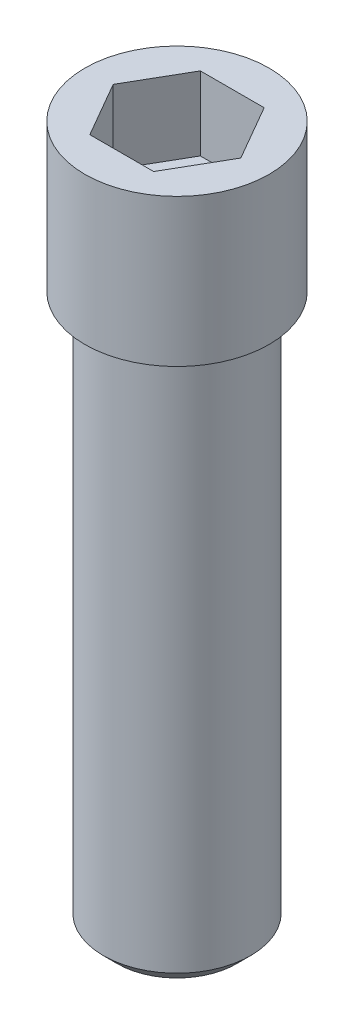
ISO-10303-21;
HEADER;
FILE_DESCRIPTION(('STEP AP214'),'2;1');
FILE_NAME('part.step','',(''),(''),'','','');
FILE_SCHEMA(('AUTOMOTIVE_DESIGN { 1 0 10303 214 1 1 1 1 }'));
ENDSEC;
DATA;
#1=APPLICATION_CONTEXT('core data for automotive mechanical design processes');
#2=APPLICATION_PROTOCOL_DEFINITION('international standard','automotive_design',2000,#1);
#3=PRODUCT_CONTEXT('',#1,'mechanical');
#4=PRODUCT('Part','Part','',(#3));
#5=PRODUCT_RELATED_PRODUCT_CATEGORY('part','',(#4));
#6=PRODUCT_DEFINITION_FORMATION('','',#4);
#7=PRODUCT_DEFINITION_CONTEXT('part definition',#1,'design');
#8=PRODUCT_DEFINITION('design','',#6,#7);
#9=PRODUCT_DEFINITION_SHAPE('','',#8);
#10=(LENGTH_UNIT() NAMED_UNIT(*) SI_UNIT(.MILLI.,.METRE.));
#11=(NAMED_UNIT(*) PLANE_ANGLE_UNIT() SI_UNIT($,.RADIAN.));
#12=(NAMED_UNIT(*) SI_UNIT($,.STERADIAN.) SOLID_ANGLE_UNIT());
#13=UNCERTAINTY_MEASURE_WITH_UNIT(LENGTH_MEASURE(1.E-05),#10,'distance_accuracy_value','');
#14=(GEOMETRIC_REPRESENTATION_CONTEXT(3) GLOBAL_UNCERTAINTY_ASSIGNED_CONTEXT((#13)) GLOBAL_UNIT_ASSIGNED_CONTEXT((#10,
#11,#12)) REPRESENTATION_CONTEXT('',''));
#15=CARTESIAN_POINT('',(0.,0.,0.));
#16=DIRECTION('',(0.,0.,1.));
#17=DIRECTION('',(1.,0.,0.));
#18=AXIS2_PLACEMENT_3D('',#15,#16,#17);
#19=CARTESIAN_POINT('',(0.,34.,0.));
#20=DIRECTION('',(0.,1.,0.));
#21=DIRECTION('',(1.,0.,0.));
#22=AXIS2_PLACEMENT_3D('',#19,#20,#21);
#23=PLANE('',#22);
#24=DIRECTION('',(-0.5,0.,0.866025403784439));
#25=VECTOR('',#24,1.);
#26=CARTESIAN_POINT('',(-1.73205080756888,34.,-3.));
#27=LINE('',#26,#25);
#28=CARTESIAN_POINT('',(-1.73205080756888,34.,-3.));
#29=VERTEX_POINT('',#28);
#30=CARTESIAN_POINT('',(-3.46410161513775,34.,0.));
#31=VERTEX_POINT('',#30);
#32=EDGE_CURVE('E148',#29,#31,#27,.T.);
#33=ORIENTED_EDGE('',*,*,#32,.T.);
#34=DIRECTION('',(0.5,0.,0.866025403784439));
#35=VECTOR('',#34,1.);
#36=CARTESIAN_POINT('',(-3.46410161513775,34.,0.));
#37=LINE('',#36,#35);
#38=CARTESIAN_POINT('',(-1.73205080756888,34.,3.));
#39=VERTEX_POINT('',#38);
#40=EDGE_CURVE('E172',#31,#39,#37,.T.);
#41=ORIENTED_EDGE('',*,*,#40,.T.);
#42=DIRECTION('',(1.,0.,0.));
#43=VECTOR('',#42,1.);
#44=CARTESIAN_POINT('',(-1.73205080756888,34.,3.));
#45=LINE('',#44,#43);
#46=CARTESIAN_POINT('',(1.73205080756888,34.,3.));
#47=VERTEX_POINT('',#46);
#48=EDGE_CURVE('E20',#39,#47,#45,.T.);
#49=ORIENTED_EDGE('',*,*,#48,.T.);
#50=DIRECTION('',(0.5,0.,-0.866025403784439));
#51=VECTOR('',#50,1.);
#52=CARTESIAN_POINT('',(1.73205080756888,34.,3.));
#53=LINE('',#52,#51);
#54=CARTESIAN_POINT('',(3.46410161513775,34.,0.));
#55=VERTEX_POINT('',#54);
#56=EDGE_CURVE('E109',#47,#55,#53,.T.);
#57=ORIENTED_EDGE('',*,*,#56,.T.);
#58=DIRECTION('',(-0.5,0.,-0.866025403784439));
#59=VECTOR('',#58,1.);
#60=CARTESIAN_POINT('',(3.46410161513775,34.,0.));
#61=LINE('',#60,#59);
#62=CARTESIAN_POINT('',(1.73205080756888,34.,-3.));
#63=VERTEX_POINT('',#62);
#64=EDGE_CURVE('E105',#55,#63,#61,.T.);
#65=ORIENTED_EDGE('',*,*,#64,.T.);
#66=DIRECTION('',(-1.,0.,0.));
#67=VECTOR('',#66,1.);
#68=CARTESIAN_POINT('',(1.73205080756888,34.,-3.));
#69=LINE('',#68,#67);
#70=EDGE_CURVE('E10',#63,#29,#69,.T.);
#71=ORIENTED_EDGE('',*,*,#70,.T.);
#72=EDGE_LOOP('',(#33,#41,#49,#57,#65,#71));
#73=FACE_BOUND('',#72,.T.);
#74=ADVANCED_FACE('F16',(#73),#23,.T.);
#75=CARTESIAN_POINT('',(1.73205080756888,38.,-3.));
#76=DIRECTION('',(0.,0.,1.));
#77=DIRECTION('',(1.,0.,0.));
#78=AXIS2_PLACEMENT_3D('',#75,#76,#77);
#79=PLANE('',#78);
#80=ORIENTED_EDGE('',*,*,#70,.F.);
#81=DIRECTION('',(0.,-1.,0.));
#82=VECTOR('',#81,1.);
#83=CARTESIAN_POINT('',(1.73205080756888,38.,-3.));
#84=LINE('',#83,#82);
#85=CARTESIAN_POINT('',(1.73205080756888,38.,-3.));
#86=VERTEX_POINT('',#85);
#87=EDGE_CURVE('E27',#86,#63,#84,.T.);
#88=ORIENTED_EDGE('',*,*,#87,.F.);
#89=DIRECTION('',(-1.,0.,0.));
#90=VECTOR('',#89,1.);
#91=CARTESIAN_POINT('',(1.73205080756888,38.,-3.));
#92=LINE('',#91,#90);
#93=CARTESIAN_POINT('',(-1.73205080756888,38.,-3.));
#94=VERTEX_POINT('',#93);
#95=EDGE_CURVE('E125',#86,#94,#92,.T.);
#96=ORIENTED_EDGE('',*,*,#95,.T.);
#97=DIRECTION('',(0.,-1.,0.));
#98=VECTOR('',#97,1.);
#99=CARTESIAN_POINT('',(-1.73205080756888,38.,-3.));
#100=LINE('',#99,#98);
#101=EDGE_CURVE('E145',#94,#29,#100,.T.);
#102=ORIENTED_EDGE('',*,*,#101,.T.);
#103=EDGE_LOOP('',(#80,#88,#96,#102));
#104=FACE_BOUND('',#103,.T.);
#105=ADVANCED_FACE('F200',(#104),#79,.T.);
#106=CARTESIAN_POINT('',(3.46410161513775,38.,0.));
#107=DIRECTION('',(-0.866025403784439,0.,0.5));
#108=DIRECTION('',(0.,1.,0.));
#109=AXIS2_PLACEMENT_3D('',#106,#107,#108);
#110=PLANE('',#109);
#111=ORIENTED_EDGE('',*,*,#64,.F.);
#112=DIRECTION('',(0.,-1.,0.));
#113=VECTOR('',#112,1.);
#114=CARTESIAN_POINT('',(3.46410161513775,38.,0.));
#115=LINE('',#114,#113);
#116=CARTESIAN_POINT('',(3.46410161513775,38.,0.));
#117=VERTEX_POINT('',#116);
#118=EDGE_CURVE('E98',#117,#55,#115,.T.);
#119=ORIENTED_EDGE('',*,*,#118,.F.);
#120=DIRECTION('',(-0.5,0.,-0.866025403784439));
#121=VECTOR('',#120,1.);
#122=CARTESIAN_POINT('',(3.46410161513775,38.,0.));
#123=LINE('',#122,#121);
#124=EDGE_CURVE('E102',#117,#86,#123,.T.);
#125=ORIENTED_EDGE('',*,*,#124,.T.);
#126=ORIENTED_EDGE('',*,*,#87,.T.);
#127=EDGE_LOOP('',(#111,#119,#125,#126));
#128=FACE_BOUND('',#127,.T.);
#129=ADVANCED_FACE('F100',(#128),#110,.T.);
#130=CARTESIAN_POINT('',(1.73205080756888,38.,3.));
#131=DIRECTION('',(-0.866025403784439,0.,-0.5));
#132=DIRECTION('',(-0.5,0.,0.866025403784439));
#133=AXIS2_PLACEMENT_3D('',#130,#131,#132);
#134=PLANE('',#133);
#135=ORIENTED_EDGE('',*,*,#56,.F.);
#136=DIRECTION('',(0.,-1.,0.));
#137=VECTOR('',#136,1.);
#138=CARTESIAN_POINT('',(1.73205080756888,38.,3.));
#139=LINE('',#138,#137);
#140=CARTESIAN_POINT('',(1.73205080756888,38.,3.));
#141=VERTEX_POINT('',#140);
#142=EDGE_CURVE('E114',#141,#47,#139,.T.);
#143=ORIENTED_EDGE('',*,*,#142,.F.);
#144=DIRECTION('',(0.5,0.,-0.866025403784439));
#145=VECTOR('',#144,1.);
#146=CARTESIAN_POINT('',(1.73205080756888,38.,3.));
#147=LINE('',#146,#145);
#148=EDGE_CURVE('E112',#141,#117,#147,.T.);
#149=ORIENTED_EDGE('',*,*,#148,.T.);
#150=ORIENTED_EDGE('',*,*,#118,.T.);
#151=EDGE_LOOP('',(#135,#143,#149,#150));
#152=FACE_BOUND('',#151,.T.);
#153=ADVANCED_FACE('F18',(#152),#134,.T.);
#154=CARTESIAN_POINT('',(-1.73205080756888,38.,3.));
#155=DIRECTION('',(0.,0.,-1.));
#156=DIRECTION('',(0.,-1.,0.));
#157=AXIS2_PLACEMENT_3D('',#154,#155,#156);
#158=PLANE('',#157);
#159=ORIENTED_EDGE('',*,*,#48,.F.);
#160=DIRECTION('',(0.,-1.,0.));
#161=VECTOR('',#160,1.);
#162=CARTESIAN_POINT('',(-1.73205080756888,38.,3.));
#163=LINE('',#162,#161);
#164=CARTESIAN_POINT('',(-1.73205080756888,38.,3.));
#165=VERTEX_POINT('',#164);
#166=EDGE_CURVE('E167',#165,#39,#163,.T.);
#167=ORIENTED_EDGE('',*,*,#166,.F.);
#168=DIRECTION('',(1.,0.,0.));
#169=VECTOR('',#168,1.);
#170=CARTESIAN_POINT('',(-1.73205080756888,38.,3.));
#171=LINE('',#170,#169);
#172=EDGE_CURVE('E119',#165,#141,#171,.T.);
#173=ORIENTED_EDGE('',*,*,#172,.T.);
#174=ORIENTED_EDGE('',*,*,#142,.T.);
#175=EDGE_LOOP('',(#159,#167,#173,#174));
#176=FACE_BOUND('',#175,.T.);
#177=ADVANCED_FACE('F187',(#176),#158,.T.);
#178=CARTESIAN_POINT('',(-3.46410161513775,38.,0.));
#179=DIRECTION('',(0.866025403784439,0.,-0.5));
#180=DIRECTION('',(0.,-1.,0.));
#181=AXIS2_PLACEMENT_3D('',#178,#179,#180);
#182=PLANE('',#181);
#183=ORIENTED_EDGE('',*,*,#40,.F.);
#184=DIRECTION('',(0.,-1.,0.));
#185=VECTOR('',#184,1.);
#186=CARTESIAN_POINT('',(-3.46410161513775,38.,0.));
#187=LINE('',#186,#185);
#188=CARTESIAN_POINT('',(-3.46410161513775,38.,0.));
#189=VERTEX_POINT('',#188);
#190=EDGE_CURVE('E147',#189,#31,#187,.T.);
#191=ORIENTED_EDGE('',*,*,#190,.F.);
#192=DIRECTION('',(0.5,0.,0.866025403784439));
#193=VECTOR('',#192,1.);
#194=CARTESIAN_POINT('',(-3.46410161513775,38.,0.));
#195=LINE('',#194,#193);
#196=EDGE_CURVE('E138',#189,#165,#195,.T.);
#197=ORIENTED_EDGE('',*,*,#196,.T.);
#198=ORIENTED_EDGE('',*,*,#166,.T.);
#199=EDGE_LOOP('',(#183,#191,#197,#198));
#200=FACE_BOUND('',#199,.T.);
#201=ADVANCED_FACE('F191',(#200),#182,.T.);
#202=CARTESIAN_POINT('',(-1.73205080756888,38.,-3.));
#203=DIRECTION('',(0.866025403784439,0.,0.5));
#204=DIRECTION('',(0.,-1.,0.));
#205=AXIS2_PLACEMENT_3D('',#202,#203,#204);
#206=PLANE('',#205);
#207=ORIENTED_EDGE('',*,*,#32,.F.);
#208=ORIENTED_EDGE('',*,*,#101,.F.);
#209=DIRECTION('',(-0.5,0.,0.866025403784439));
#210=VECTOR('',#209,1.);
#211=CARTESIAN_POINT('',(-1.73205080756888,38.,-3.));
#212=LINE('',#211,#210);
#213=EDGE_CURVE('E132',#94,#189,#212,.T.);
#214=ORIENTED_EDGE('',*,*,#213,.T.);
#215=ORIENTED_EDGE('',*,*,#190,.T.);
#216=EDGE_LOOP('',(#207,#208,#214,#215));
#217=FACE_BOUND('',#216,.T.);
#218=ADVANCED_FACE('F194',(#217),#206,.T.);
#219=CARTESIAN_POINT('',(0.,505.,0.));
#220=DIRECTION('',(0.,-1.,0.));
#221=DIRECTION('',(0.,0.,1.));
#222=AXIS2_PLACEMENT_3D('',#219,#220,#221);
#223=CYLINDRICAL_SURFACE('',#222,4.);
#224=CARTESIAN_POINT('',(0.,30.,0.));
#225=DIRECTION('',(0.,1.,0.));
#226=DIRECTION('',(0.,0.,1.));
#227=AXIS2_PLACEMENT_3D('',#224,#225,#226);
#228=CIRCLE('',#227,4.);
#229=CARTESIAN_POINT('',(0.,30.,4.));
#230=VERTEX_POINT('',#229);
#231=EDGE_CURVE('E155',#230,#230,#228,.T.);
#232=ORIENTED_EDGE('',*,*,#231,.F.);
#233=EDGE_LOOP('',(#232));
#234=FACE_BOUND('',#233,.T.);
#235=CARTESIAN_POINT('',(0.,0.766999999999962,0.));
#236=DIRECTION('',(0.,1.,0.));
#237=DIRECTION('',(0.,0.,1.));
#238=AXIS2_PLACEMENT_3D('',#235,#236,#237);
#239=CIRCLE('',#238,4.);
#240=CARTESIAN_POINT('',(0.,0.766999999999962,4.));
#241=VERTEX_POINT('',#240);
#242=EDGE_CURVE('E142',#241,#241,#239,.T.);
#243=ORIENTED_EDGE('',*,*,#242,.T.);
#244=EDGE_LOOP('',(#243));
#245=FACE_BOUND('',#244,.T.);
#246=ADVANCED_FACE('F217',(#234,#245),#223,.T.);
#247=CARTESIAN_POINT('',(0.,30.,0.));
#248=DIRECTION('',(0.,1.,0.));
#249=DIRECTION('',(1.,0.,0.));
#250=AXIS2_PLACEMENT_3D('',#247,#248,#249);
#251=PLANE('',#250);
#252=ORIENTED_EDGE('',*,*,#231,.T.);
#253=EDGE_LOOP('',(#252));
#254=FACE_BOUND('',#253,.T.);
#255=CARTESIAN_POINT('',(0.,30.,0.));
#256=DIRECTION('',(0.,1.,0.));
#257=DIRECTION('',(0.,0.,1.));
#258=AXIS2_PLACEMENT_3D('',#255,#256,#257);
#259=CIRCLE('',#258,5.);
#260=CARTESIAN_POINT('',(0.,30.,5.));
#261=VERTEX_POINT('',#260);
#262=EDGE_CURVE('E150',#261,#261,#259,.T.);
#263=ORIENTED_EDGE('',*,*,#262,.F.);
#264=EDGE_LOOP('',(#263));
#265=FACE_BOUND('',#264,.T.);
#266=ADVANCED_FACE('F224',(#254,#265),#251,.F.);
#267=CARTESIAN_POINT('',(0.,505.,0.));
#268=DIRECTION('',(0.,-1.,0.));
#269=DIRECTION('',(0.,0.,1.));
#270=AXIS2_PLACEMENT_3D('',#267,#268,#269);
#271=CYLINDRICAL_SURFACE('',#270,5.);
#272=CARTESIAN_POINT('',(0.,38.,0.));
#273=DIRECTION('',(0.,1.,0.));
#274=DIRECTION('',(0.,0.,1.));
#275=AXIS2_PLACEMENT_3D('',#272,#273,#274);
#276=CIRCLE('',#275,5.);
#277=CARTESIAN_POINT('',(0.,38.,5.));
#278=VERTEX_POINT('',#277);
#279=EDGE_CURVE('E136',#278,#278,#276,.T.);
#280=ORIENTED_EDGE('',*,*,#279,.F.);
#281=EDGE_LOOP('',(#280));
#282=FACE_BOUND('',#281,.T.);
#283=ORIENTED_EDGE('',*,*,#262,.T.);
#284=EDGE_LOOP('',(#283));
#285=FACE_BOUND('',#284,.T.);
#286=ADVANCED_FACE('F229',(#282,#285),#271,.T.);
#287=CARTESIAN_POINT('',(-5.,38.,0.));
#288=DIRECTION('',(0.,-1.,0.));
#289=DIRECTION('',(0.,0.,-1.));
#290=AXIS2_PLACEMENT_3D('',#287,#288,#289);
#291=PLANE('',#290);
#292=ORIENTED_EDGE('',*,*,#196,.F.);
#293=ORIENTED_EDGE('',*,*,#213,.F.);
#294=ORIENTED_EDGE('',*,*,#95,.F.);
#295=ORIENTED_EDGE('',*,*,#124,.F.);
#296=ORIENTED_EDGE('',*,*,#148,.F.);
#297=ORIENTED_EDGE('',*,*,#172,.F.);
#298=EDGE_LOOP('',(#292,#293,#294,#295,#296,#297));
#299=FACE_BOUND('',#298,.T.);
#300=ORIENTED_EDGE('',*,*,#279,.T.);
#301=EDGE_LOOP('',(#300));
#302=FACE_BOUND('',#301,.T.);
#303=ADVANCED_FACE('F122',(#299,#302),#291,.F.);
#304=CARTESIAN_POINT('',(0.,0.,0.));
#305=DIRECTION('',(0.,1.,0.));
#306=DIRECTION('',(1.,0.,0.));
#307=AXIS2_PLACEMENT_3D('',#304,#305,#306);
#308=PLANE('',#307);
#309=CARTESIAN_POINT('',(0.,0.,0.));
#310=DIRECTION('',(0.,1.,0.));
#311=DIRECTION('',(0.,0.,1.));
#312=AXIS2_PLACEMENT_3D('',#309,#310,#311);
#313=CIRCLE('',#312,3.233);
#314=CARTESIAN_POINT('',(0.,0.,3.233));
#315=VERTEX_POINT('',#314);
#316=EDGE_CURVE('E139',#315,#315,#313,.T.);
#317=ORIENTED_EDGE('',*,*,#316,.F.);
#318=EDGE_LOOP('',(#317));
#319=FACE_BOUND('',#318,.T.);
#320=ADVANCED_FACE('F221',(#319),#308,.F.);
#321=CARTESIAN_POINT('',(0.,0.,0.));
#322=DIRECTION('',(0.,1.,0.));
#323=DIRECTION('',(0.,0.,1.));
#324=AXIS2_PLACEMENT_3D('',#321,#322,#323);
#325=CONICAL_SURFACE('',#324,3.233,0.7853981634);
#326=ORIENTED_EDGE('',*,*,#316,.T.);
#327=EDGE_LOOP('',(#326));
#328=FACE_BOUND('',#327,.T.);
#329=ORIENTED_EDGE('',*,*,#242,.F.);
#330=EDGE_LOOP('',(#329));
#331=FACE_BOUND('',#330,.T.);
#332=ADVANCED_FACE('F218',(#328,#331),#325,.T.);
#333=CLOSED_SHELL('',(#74,#105,#129,#153,#177,#201,#218,#246,#266,#286,#303,#320,#332));
#334=MANIFOLD_SOLID_BREP('B1',#333);
#335=ADVANCED_BREP_SHAPE_REPRESENTATION('',(#18,#334),#14);
#336=SHAPE_DEFINITION_REPRESENTATION(#9,#335);
ENDSEC;
END-ISO-10303-21;
